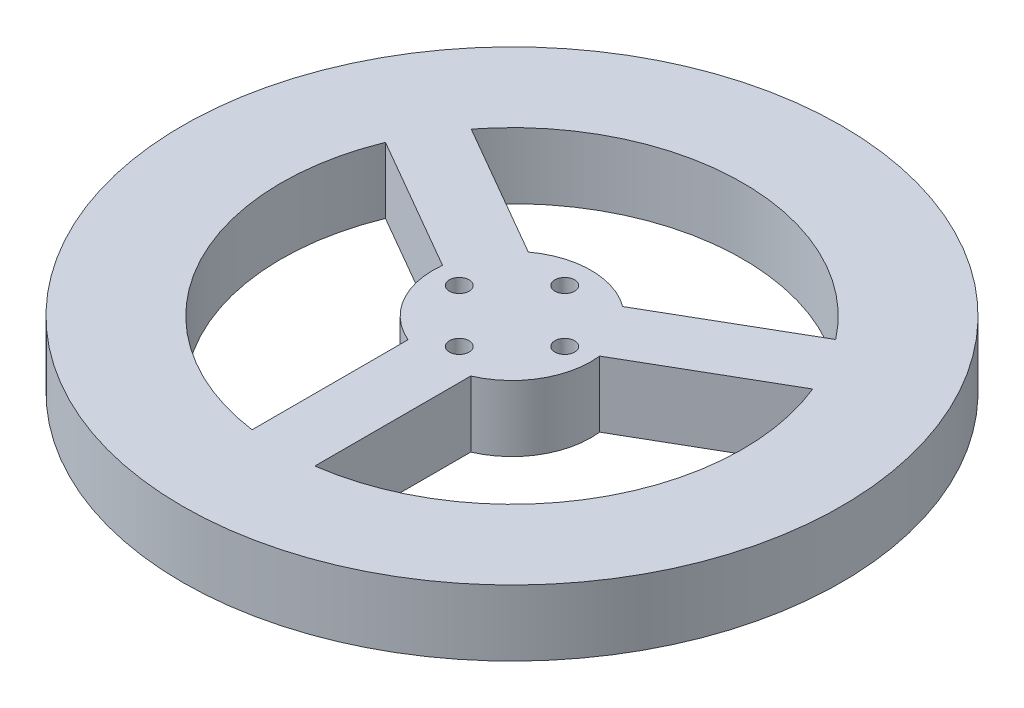
ISO-10303-21;
HEADER;
FILE_DESCRIPTION(('STEP AP214'),'2;1');
FILE_NAME('part.step','',(''),(''),'','','');
FILE_SCHEMA(('AUTOMOTIVE_DESIGN { 1 0 10303 214 1 1 1 1 }'));
ENDSEC;
DATA;
#1=APPLICATION_CONTEXT('core data for automotive mechanical design processes');
#2=APPLICATION_PROTOCOL_DEFINITION('international standard','automotive_design',2000,#1);
#3=PRODUCT_CONTEXT('',#1,'mechanical');
#4=PRODUCT('Part','Part','',(#3));
#5=PRODUCT_RELATED_PRODUCT_CATEGORY('part','',(#4));
#6=PRODUCT_DEFINITION_FORMATION('','',#4);
#7=PRODUCT_DEFINITION_CONTEXT('part definition',#1,'design');
#8=PRODUCT_DEFINITION('design','',#6,#7);
#9=PRODUCT_DEFINITION_SHAPE('','',#8);
#10=(LENGTH_UNIT() NAMED_UNIT(*) SI_UNIT(.MILLI.,.METRE.));
#11=(NAMED_UNIT(*) PLANE_ANGLE_UNIT() SI_UNIT($,.RADIAN.));
#12=(NAMED_UNIT(*) SI_UNIT($,.STERADIAN.) SOLID_ANGLE_UNIT());
#13=UNCERTAINTY_MEASURE_WITH_UNIT(LENGTH_MEASURE(1.E-05),#10,'distance_accuracy_value','');
#14=(GEOMETRIC_REPRESENTATION_CONTEXT(3) GLOBAL_UNCERTAINTY_ASSIGNED_CONTEXT((#13)) GLOBAL_UNIT_ASSIGNED_CONTEXT((#10,
#11,#12)) REPRESENTATION_CONTEXT('',''));
#15=CARTESIAN_POINT('',(0.,0.,0.));
#16=DIRECTION('',(0.,0.,1.));
#17=DIRECTION('',(1.,0.,0.));
#18=AXIS2_PLACEMENT_3D('',#15,#16,#17);
#19=CARTESIAN_POINT('',(0.,10.,0.));
#20=DIRECTION('',(0.,-1.,0.));
#21=DIRECTION('',(0.,0.,-1.));
#22=AXIS2_PLACEMENT_3D('',#19,#20,#21);
#23=CYLINDRICAL_SURFACE('',#22,12.);
#24=CARTESIAN_POINT('',(0.,0.,0.));
#25=DIRECTION('',(0.,1.,0.));
#26=DIRECTION('',(0.,0.,1.));
#27=AXIS2_PLACEMENT_3D('',#24,#25,#26);
#28=CIRCLE('',#27,12.);
#29=CARTESIAN_POINT('',(4.76313972081454,0.,11.0141953859553));
#30=VERTEX_POINT('',#29);
#31=CARTESIAN_POINT('',(11.9201428668899,0.,-1.38209769297769));
#32=VERTEX_POINT('',#31);
#33=EDGE_CURVE('E228',#30,#32,#28,.T.);
#34=ORIENTED_EDGE('',*,*,#33,.T.);
#35=DIRECTION('',(0.,-1.,0.));
#36=VECTOR('',#35,1.);
#37=CARTESIAN_POINT('',(11.9201428668899,10.,-1.38209769297769));
#38=LINE('',#37,#36);
#39=CARTESIAN_POINT('',(11.9201428668899,10.,-1.38209769297769));
#40=VERTEX_POINT('',#39);
#41=EDGE_CURVE('E11',#40,#32,#38,.T.);
#42=ORIENTED_EDGE('',*,*,#41,.F.);
#43=CARTESIAN_POINT('',(0.,10.,0.));
#44=DIRECTION('',(0.,1.,0.));
#45=DIRECTION('',(0.,0.,1.));
#46=AXIS2_PLACEMENT_3D('',#43,#44,#45);
#47=CIRCLE('',#46,12.);
#48=CARTESIAN_POINT('',(4.76313972081454,10.,11.0141953859553));
#49=VERTEX_POINT('',#48);
#50=EDGE_CURVE('E143',#49,#40,#47,.T.);
#51=ORIENTED_EDGE('',*,*,#50,.F.);
#52=DIRECTION('',(0.,-1.,0.));
#53=VECTOR('',#52,1.);
#54=CARTESIAN_POINT('',(4.76313972081454,10.,11.0141953859553));
#55=LINE('',#54,#53);
#56=EDGE_CURVE('E57',#49,#30,#55,.T.);
#57=ORIENTED_EDGE('',*,*,#56,.T.);
#58=EDGE_LOOP('',(#34,#42,#51,#57));
#59=FACE_BOUND('',#58,.T.);
#60=ADVANCED_FACE('F38',(#59),#23,.T.);
#61=CARTESIAN_POINT('',(2.38156986040723,10.,4.12500000000001));
#62=DIRECTION('',(-0.500000000000003,0.,-0.866025403784437));
#63=DIRECTION('',(-0.866025403784437,0.,0.500000000000003));
#64=AXIS2_PLACEMENT_3D('',#61,#62,#63);
#65=PLANE('',#64);
#66=DIRECTION('',(0.866025403784437,0.,-0.500000000000003));
#67=VECTOR('',#66,1.);
#68=CARTESIAN_POINT('',(2.38156986040723,0.,4.12500000000001));
#69=LINE('',#68,#67);
#70=CARTESIAN_POINT('',(32.4104621976216,0.,-13.2121890743572));
#71=VERTEX_POINT('',#70);
#72=EDGE_CURVE('E149',#32,#71,#69,.T.);
#73=ORIENTED_EDGE('',*,*,#72,.T.);
#74=DIRECTION('',(0.,-1.,0.));
#75=VECTOR('',#74,1.);
#76=CARTESIAN_POINT('',(32.4104621976216,10.,-13.2121890743572));
#77=LINE('',#76,#75);
#78=CARTESIAN_POINT('',(32.4104621976216,10.,-13.2121890743572));
#79=VERTEX_POINT('',#78);
#80=EDGE_CURVE('E48',#79,#71,#77,.T.);
#81=ORIENTED_EDGE('',*,*,#80,.F.);
#82=DIRECTION('',(0.866025403784437,0.,-0.500000000000003));
#83=VECTOR('',#82,1.);
#84=CARTESIAN_POINT('',(2.38156986040723,10.,4.12500000000001));
#85=LINE('',#84,#83);
#86=EDGE_CURVE('E136',#40,#79,#85,.T.);
#87=ORIENTED_EDGE('',*,*,#86,.F.);
#88=ORIENTED_EDGE('',*,*,#41,.T.);
#89=EDGE_LOOP('',(#73,#81,#87,#88));
#90=FACE_BOUND('',#89,.T.);
#91=ADVANCED_FACE('F148',(#90),#65,.F.);
#92=CARTESIAN_POINT('',(0.,10.,0.));
#93=DIRECTION('',(0.,-1.,0.));
#94=DIRECTION('',(0.,0.,-1.));
#95=AXIS2_PLACEMENT_3D('',#92,#93,#94);
#96=CYLINDRICAL_SURFACE('',#95,35.);
#97=CARTESIAN_POINT('',(0.,0.,0.));
#98=DIRECTION('',(0.,1.,0.));
#99=DIRECTION('',(0.,0.,1.));
#100=AXIS2_PLACEMENT_3D('',#97,#98,#99);
#101=CIRCLE('',#100,35.);
#102=CARTESIAN_POINT('',(4.76313972081497,0.,34.6743781487136));
#103=VERTEX_POINT('',#102);
#104=EDGE_CURVE('E215',#103,#71,#101,.T.);
#105=ORIENTED_EDGE('',*,*,#104,.F.);
#106=DIRECTION('',(0.,-1.,0.));
#107=VECTOR('',#106,1.);
#108=CARTESIAN_POINT('',(4.76313972081497,10.,34.6743781487136));
#109=LINE('',#108,#107);
#110=CARTESIAN_POINT('',(4.76313972081497,10.,34.6743781487136));
#111=VERTEX_POINT('',#110);
#112=EDGE_CURVE('E95',#111,#103,#109,.T.);
#113=ORIENTED_EDGE('',*,*,#112,.F.);
#114=CARTESIAN_POINT('',(0.,10.,0.));
#115=DIRECTION('',(0.,1.,0.));
#116=DIRECTION('',(0.,0.,1.));
#117=AXIS2_PLACEMENT_3D('',#114,#115,#116);
#118=CIRCLE('',#117,35.);
#119=EDGE_CURVE('E142',#111,#79,#118,.T.);
#120=ORIENTED_EDGE('',*,*,#119,.T.);
#121=ORIENTED_EDGE('',*,*,#80,.T.);
#122=EDGE_LOOP('',(#105,#113,#120,#121));
#123=FACE_BOUND('',#122,.T.);
#124=ADVANCED_FACE('F153',(#123),#96,.F.);
#125=CARTESIAN_POINT('',(-2.38156986040719,10.,4.12499999999998));
#126=DIRECTION('',(-0.5,0.,0.866025403784438));
#127=DIRECTION('',(0.866025403784438,0.,0.5));
#128=AXIS2_PLACEMENT_3D('',#125,#126,#127);
#129=PLANE('',#128);
#130=DIRECTION('',(-0.866025403784439,0.,-0.5));
#131=VECTOR('',#130,1.);
#132=CARTESIAN_POINT('',(-2.38156986040719,0.,4.12499999999998));
#133=LINE('',#132,#131);
#134=CARTESIAN_POINT('',(-11.9201428668899,0.,-1.3820976929777));
#135=VERTEX_POINT('',#134);
#136=CARTESIAN_POINT('',(-32.4104621976211,0.,-13.2121890743567));
#137=VERTEX_POINT('',#136);
#138=EDGE_CURVE('E219',#135,#137,#133,.T.);
#139=ORIENTED_EDGE('',*,*,#138,.F.);
#140=DIRECTION('',(0.,-1.,0.));
#141=VECTOR('',#140,1.);
#142=CARTESIAN_POINT('',(-11.9201428668899,10.,-1.3820976929777));
#143=LINE('',#142,#141);
#144=CARTESIAN_POINT('',(-11.9201428668899,10.,-1.3820976929777));
#145=VERTEX_POINT('',#144);
#146=EDGE_CURVE('E237',#145,#135,#143,.T.);
#147=ORIENTED_EDGE('',*,*,#146,.F.);
#148=DIRECTION('',(-0.866025403784439,0.,-0.5));
#149=VECTOR('',#148,1.);
#150=CARTESIAN_POINT('',(-2.38156986040719,10.,4.12499999999998));
#151=LINE('',#150,#149);
#152=CARTESIAN_POINT('',(-32.4104621976211,10.,-13.2121890743567));
#153=VERTEX_POINT('',#152);
#154=EDGE_CURVE('E169',#145,#153,#151,.T.);
#155=ORIENTED_EDGE('',*,*,#154,.T.);
#156=DIRECTION('',(0.,-1.,0.));
#157=VECTOR('',#156,1.);
#158=CARTESIAN_POINT('',(-32.4104621976211,10.,-13.2121890743567));
#159=LINE('',#158,#157);
#160=EDGE_CURVE('E239',#153,#137,#159,.T.);
#161=ORIENTED_EDGE('',*,*,#160,.T.);
#162=EDGE_LOOP('',(#139,#147,#155,#161));
#163=FACE_BOUND('',#162,.T.);
#164=ADVANCED_FACE('F276',(#163),#129,.T.);
#165=CARTESIAN_POINT('',(0.,10.,0.));
#166=DIRECTION('',(0.,-1.,0.));
#167=DIRECTION('',(0.,0.,-1.));
#168=AXIS2_PLACEMENT_3D('',#165,#166,#167);
#169=CYLINDRICAL_SURFACE('',#168,12.);
#170=CARTESIAN_POINT('',(0.,0.,0.));
#171=DIRECTION('',(0.,1.,0.));
#172=DIRECTION('',(0.,0.,1.));
#173=AXIS2_PLACEMENT_3D('',#170,#171,#172);
#174=CIRCLE('',#173,12.);
#175=CARTESIAN_POINT('',(-4.76313972081425,0.,11.0141953859554));
#176=VERTEX_POINT('',#175);
#177=EDGE_CURVE('E222',#135,#176,#174,.T.);
#178=ORIENTED_EDGE('',*,*,#177,.T.);
#179=DIRECTION('',(0.,-1.,0.));
#180=VECTOR('',#179,1.);
#181=CARTESIAN_POINT('',(-4.76313972081425,10.,11.0141953859554));
#182=LINE('',#181,#180);
#183=CARTESIAN_POINT('',(-4.76313972081425,10.,11.0141953859554));
#184=VERTEX_POINT('',#183);
#185=EDGE_CURVE('E243',#184,#176,#182,.T.);
#186=ORIENTED_EDGE('',*,*,#185,.F.);
#187=CARTESIAN_POINT('',(0.,10.,0.));
#188=DIRECTION('',(0.,1.,0.));
#189=DIRECTION('',(0.,0.,1.));
#190=AXIS2_PLACEMENT_3D('',#187,#188,#189);
#191=CIRCLE('',#190,12.);
#192=EDGE_CURVE('E536',#145,#184,#191,.T.);
#193=ORIENTED_EDGE('',*,*,#192,.F.);
#194=ORIENTED_EDGE('',*,*,#146,.T.);
#195=EDGE_LOOP('',(#178,#186,#193,#194));
#196=FACE_BOUND('',#195,.T.);
#197=ADVANCED_FACE('F286',(#196),#169,.T.);
#198=CARTESIAN_POINT('',(-4.7631397208145,10.,1.06893471664035E-13));
#199=DIRECTION('',(1.,0.,0.));
#200=DIRECTION('',(0.,0.,-1.));
#201=AXIS2_PLACEMENT_3D('',#198,#199,#200);
#202=PLANE('',#201);
#203=DIRECTION('',(0.,0.,1.));
#204=VECTOR('',#203,1.);
#205=CARTESIAN_POINT('',(-4.7631397208145,0.,1.06893471664035E-13));
#206=LINE('',#205,#204);
#207=CARTESIAN_POINT('',(-4.7631397208137,0.,34.674378148714));
#208=VERTEX_POINT('',#207);
#209=EDGE_CURVE('E225',#176,#208,#206,.T.);
#210=ORIENTED_EDGE('',*,*,#209,.T.);
#211=DIRECTION('',(0.,-1.,0.));
#212=VECTOR('',#211,1.);
#213=CARTESIAN_POINT('',(-4.7631397208137,10.,34.674378148714));
#214=LINE('',#213,#212);
#215=CARTESIAN_POINT('',(-4.7631397208137,10.,34.674378148714));
#216=VERTEX_POINT('',#215);
#217=EDGE_CURVE('E241',#216,#208,#214,.T.);
#218=ORIENTED_EDGE('',*,*,#217,.F.);
#219=DIRECTION('',(0.,0.,1.));
#220=VECTOR('',#219,1.);
#221=CARTESIAN_POINT('',(-4.7631397208145,10.,1.06893471664035E-13));
#222=LINE('',#221,#220);
#223=EDGE_CURVE('E163',#184,#216,#222,.T.);
#224=ORIENTED_EDGE('',*,*,#223,.F.);
#225=ORIENTED_EDGE('',*,*,#185,.T.);
#226=EDGE_LOOP('',(#210,#218,#224,#225));
#227=FACE_BOUND('',#226,.T.);
#228=ADVANCED_FACE('F283',(#227),#202,.F.);
#229=CARTESIAN_POINT('',(0.,10.,0.));
#230=DIRECTION('',(0.,-1.,0.));
#231=DIRECTION('',(0.,0.,-1.));
#232=AXIS2_PLACEMENT_3D('',#229,#230,#231);
#233=CYLINDRICAL_SURFACE('',#232,12.);
#234=CARTESIAN_POINT('',(0.,0.,0.));
#235=DIRECTION('',(0.,1.,0.));
#236=DIRECTION('',(0.,0.,1.));
#237=AXIS2_PLACEMENT_3D('',#234,#235,#236);
#238=CIRCLE('',#237,12.);
#239=CARTESIAN_POINT('',(7.15700314607549,0.,-9.63209769297767));
#240=VERTEX_POINT('',#239);
#241=CARTESIAN_POINT('',(-7.1570031460755,0.,-9.63209769297766));
#242=VERTEX_POINT('',#241);
#243=EDGE_CURVE('E198',#240,#242,#238,.T.);
#244=ORIENTED_EDGE('',*,*,#243,.T.);
#245=DIRECTION('',(0.,-1.,0.));
#246=VECTOR('',#245,1.);
#247=CARTESIAN_POINT('',(-7.1570031460755,10.,-9.63209769297766));
#248=LINE('',#247,#246);
#249=CARTESIAN_POINT('',(-7.1570031460755,10.,-9.63209769297766));
#250=VERTEX_POINT('',#249);
#251=EDGE_CURVE('E42',#250,#242,#248,.T.);
#252=ORIENTED_EDGE('',*,*,#251,.F.);
#253=CARTESIAN_POINT('',(0.,10.,0.));
#254=DIRECTION('',(0.,1.,0.));
#255=DIRECTION('',(0.,0.,1.));
#256=AXIS2_PLACEMENT_3D('',#253,#254,#255);
#257=CIRCLE('',#256,12.);
#258=CARTESIAN_POINT('',(7.15700314607549,10.,-9.63209769297767));
#259=VERTEX_POINT('',#258);
#260=EDGE_CURVE('E170',#259,#250,#257,.T.);
#261=ORIENTED_EDGE('',*,*,#260,.F.);
#262=DIRECTION('',(0.,-1.,0.));
#263=VECTOR('',#262,1.);
#264=CARTESIAN_POINT('',(7.15700314607549,10.,-9.63209769297767));
#265=LINE('',#264,#263);
#266=EDGE_CURVE('E247',#259,#240,#265,.T.);
#267=ORIENTED_EDGE('',*,*,#266,.T.);
#268=EDGE_LOOP('',(#244,#252,#261,#267));
#269=FACE_BOUND('',#268,.T.);
#270=ADVANCED_FACE('F40',(#269),#233,.T.);
#271=CARTESIAN_POINT('',(2.3815698604072,10.,-4.12500000000001));
#272=DIRECTION('',(-0.499999999999997,0.,0.86602540378444));
#273=DIRECTION('',(0.86602540378444,0.,0.499999999999997));
#274=AXIS2_PLACEMENT_3D('',#271,#272,#273);
#275=PLANE('',#274);
#276=DIRECTION('',(-0.86602540378444,0.,-0.499999999999997));
#277=VECTOR('',#276,1.);
#278=CARTESIAN_POINT('',(2.3815698604072,0.,-4.12500000000001));
#279=LINE('',#278,#277);
#280=CARTESIAN_POINT('',(-27.647322476807,0.,-21.4621890743568));
#281=VERTEX_POINT('',#280);
#282=EDGE_CURVE('E202',#242,#281,#279,.T.);
#283=ORIENTED_EDGE('',*,*,#282,.T.);
#284=DIRECTION('',(0.,-1.,0.));
#285=VECTOR('',#284,1.);
#286=CARTESIAN_POINT('',(-27.647322476807,10.,-21.4621890743568));
#287=LINE('',#286,#285);
#288=CARTESIAN_POINT('',(-27.647322476807,10.,-21.4621890743568));
#289=VERTEX_POINT('',#288);
#290=EDGE_CURVE('E250',#289,#281,#287,.T.);
#291=ORIENTED_EDGE('',*,*,#290,.F.);
#292=DIRECTION('',(-0.86602540378444,0.,-0.499999999999997));
#293=VECTOR('',#292,1.);
#294=CARTESIAN_POINT('',(2.3815698604072,10.,-4.12500000000001));
#295=LINE('',#294,#293);
#296=EDGE_CURVE('E108',#250,#289,#295,.T.);
#297=ORIENTED_EDGE('',*,*,#296,.F.);
#298=ORIENTED_EDGE('',*,*,#251,.T.);
#299=EDGE_LOOP('',(#283,#291,#297,#298));
#300=FACE_BOUND('',#299,.T.);
#301=ADVANCED_FACE('F252',(#300),#275,.F.);
#302=CARTESIAN_POINT('',(27.647322476807,0.,-21.4621890743569));
#303=VERTEX_POINT('',#302);
#304=EDGE_CURVE('E208',#303,#281,#101,.T.);
#305=ORIENTED_EDGE('',*,*,#304,.F.);
#306=DIRECTION('',(0.,-1.,0.));
#307=VECTOR('',#306,1.);
#308=CARTESIAN_POINT('',(27.647322476807,10.,-21.4621890743569));
#309=LINE('',#308,#307);
#310=CARTESIAN_POINT('',(27.647322476807,10.,-21.4621890743569));
#311=VERTEX_POINT('',#310);
#312=EDGE_CURVE('E249',#311,#303,#309,.T.);
#313=ORIENTED_EDGE('',*,*,#312,.F.);
#314=EDGE_CURVE('E157',#311,#289,#118,.T.);
#315=ORIENTED_EDGE('',*,*,#314,.T.);
#316=ORIENTED_EDGE('',*,*,#290,.T.);
#317=EDGE_LOOP('',(#305,#313,#315,#316));
#318=FACE_BOUND('',#317,.T.);
#319=ADVANCED_FACE('F262',(#318),#96,.F.);
#320=CARTESIAN_POINT('',(4.76313972081435,10.,0.));
#321=DIRECTION('',(1.,0.,0.));
#322=DIRECTION('',(0.,0.,-1.));
#323=AXIS2_PLACEMENT_3D('',#320,#321,#322);
#324=PLANE('',#323);
#325=DIRECTION('',(0.,0.,1.));
#326=VECTOR('',#325,1.);
#327=CARTESIAN_POINT('',(4.76313972081435,0.,0.));
#328=LINE('',#327,#326);
#329=EDGE_CURVE('E231',#30,#103,#328,.T.);
#330=ORIENTED_EDGE('',*,*,#329,.F.);
#331=ORIENTED_EDGE('',*,*,#56,.F.);
#332=DIRECTION('',(0.,0.,1.));
#333=VECTOR('',#332,1.);
#334=CARTESIAN_POINT('',(4.76313972081435,10.,0.));
#335=LINE('',#334,#333);
#336=EDGE_CURVE('E154',#49,#111,#335,.T.);
#337=ORIENTED_EDGE('',*,*,#336,.T.);
#338=ORIENTED_EDGE('',*,*,#112,.T.);
#339=EDGE_LOOP('',(#330,#331,#337,#338));
#340=FACE_BOUND('',#339,.T.);
#341=ADVANCED_FACE('F264',(#340),#324,.T.);
#342=EDGE_CURVE('E216',#137,#208,#101,.T.);
#343=ORIENTED_EDGE('',*,*,#342,.F.);
#344=ORIENTED_EDGE('',*,*,#160,.F.);
#345=EDGE_CURVE('E156',#153,#216,#118,.T.);
#346=ORIENTED_EDGE('',*,*,#345,.T.);
#347=ORIENTED_EDGE('',*,*,#217,.T.);
#348=EDGE_LOOP('',(#343,#344,#346,#347));
#349=FACE_BOUND('',#348,.T.);
#350=ADVANCED_FACE('F266',(#349),#96,.F.);
#351=CARTESIAN_POINT('',(-2.3815698604072,10.,-4.12500000000001));
#352=DIRECTION('',(-0.499999999999999,0.,-0.86602540378444));
#353=DIRECTION('',(-0.86602540378444,0.,0.499999999999999));
#354=AXIS2_PLACEMENT_3D('',#351,#352,#353);
#355=PLANE('',#354);
#356=DIRECTION('',(0.86602540378444,0.,-0.499999999999999));
#357=VECTOR('',#356,1.);
#358=CARTESIAN_POINT('',(-2.3815698604072,0.,-4.12500000000001));
#359=LINE('',#358,#357);
#360=EDGE_CURVE('E214',#240,#303,#359,.T.);
#361=ORIENTED_EDGE('',*,*,#360,.F.);
#362=ORIENTED_EDGE('',*,*,#266,.F.);
#363=DIRECTION('',(0.86602540378444,0.,-0.499999999999999));
#364=VECTOR('',#363,1.);
#365=CARTESIAN_POINT('',(-2.3815698604072,10.,-4.12500000000001));
#366=LINE('',#365,#364);
#367=EDGE_CURVE('E165',#259,#311,#366,.T.);
#368=ORIENTED_EDGE('',*,*,#367,.T.);
#369=ORIENTED_EDGE('',*,*,#312,.T.);
#370=EDGE_LOOP('',(#361,#362,#368,#369));
#371=FACE_BOUND('',#370,.T.);
#372=ADVANCED_FACE('F258',(#371),#355,.T.);
#373=CARTESIAN_POINT('',(0.,10.,0.));
#374=DIRECTION('',(0.,-1.,0.));
#375=DIRECTION('',(0.,0.,-1.));
#376=AXIS2_PLACEMENT_3D('',#373,#374,#375);
#377=CYLINDRICAL_SURFACE('',#376,50.);
#378=CARTESIAN_POINT('',(0.,10.,0.));
#379=DIRECTION('',(0.,1.,0.));
#380=DIRECTION('',(0.,0.,1.));
#381=AXIS2_PLACEMENT_3D('',#378,#379,#380);
#382=CIRCLE('',#381,50.);
#383=CARTESIAN_POINT('',(0.,10.,50.));
#384=VERTEX_POINT('',#383);
#385=EDGE_CURVE('E158',#384,#384,#382,.T.);
#386=ORIENTED_EDGE('',*,*,#385,.F.);
#387=EDGE_LOOP('',(#386));
#388=FACE_BOUND('',#387,.T.);
#389=CARTESIAN_POINT('',(0.,0.,0.));
#390=DIRECTION('',(0.,1.,0.));
#391=DIRECTION('',(0.,0.,1.));
#392=AXIS2_PLACEMENT_3D('',#389,#390,#391);
#393=CIRCLE('',#392,50.);
#394=CARTESIAN_POINT('',(0.,0.,50.));
#395=VERTEX_POINT('',#394);
#396=EDGE_CURVE('E172',#395,#395,#393,.T.);
#397=ORIENTED_EDGE('',*,*,#396,.T.);
#398=EDGE_LOOP('',(#397));
#399=FACE_BOUND('',#398,.T.);
#400=ADVANCED_FACE('F295',(#388,#399),#377,.T.);
#401=CARTESIAN_POINT('',(0.,10.,0.));
#402=DIRECTION('',(0.,1.,0.));
#403=DIRECTION('',(0.,0.,1.));
#404=AXIS2_PLACEMENT_3D('',#401,#402,#403);
#405=PLANE('',#404);
#406=CARTESIAN_POINT('',(0.,10.,-8.));
#407=DIRECTION('',(0.,1.,0.));
#408=DIRECTION('',(0.,0.,1.));
#409=AXIS2_PLACEMENT_3D('',#406,#407,#408);
#410=CIRCLE('',#409,1.5);
#411=CARTESIAN_POINT('',(0.,10.,-6.5));
#412=VERTEX_POINT('',#411);
#413=EDGE_CURVE('E193',#412,#412,#410,.T.);
#414=ORIENTED_EDGE('',*,*,#413,.F.);
#415=EDGE_LOOP('',(#414));
#416=FACE_BOUND('',#415,.T.);
#417=CARTESIAN_POINT('',(8.00000000000023,10.,-2.26393958003914E-13));
#418=DIRECTION('',(0.,1.,0.));
#419=DIRECTION('',(0.,0.,1.));
#420=AXIS2_PLACEMENT_3D('',#417,#418,#419);
#421=CIRCLE('',#420,1.50000000000018);
#422=CARTESIAN_POINT('',(8.00000000000023,10.,1.49999999999995));
#423=VERTEX_POINT('',#422);
#424=EDGE_CURVE('E187',#423,#423,#421,.T.);
#425=ORIENTED_EDGE('',*,*,#424,.F.);
#426=EDGE_LOOP('',(#425));
#427=FACE_BOUND('',#426,.T.);
#428=CARTESIAN_POINT('',(4.52787916007828E-13,10.,8.));
#429=DIRECTION('',(0.,1.,0.));
#430=DIRECTION('',(0.,0.,1.));
#431=AXIS2_PLACEMENT_3D('',#428,#429,#430);
#432=CIRCLE('',#431,1.50000000000049);
#433=CARTESIAN_POINT('',(4.52787916007828E-13,10.,9.50000000000049));
#434=VERTEX_POINT('',#433);
#435=EDGE_CURVE('E181',#434,#434,#432,.T.);
#436=ORIENTED_EDGE('',*,*,#435,.F.);
#437=EDGE_LOOP('',(#436));
#438=FACE_BOUND('',#437,.T.);
#439=CARTESIAN_POINT('',(-7.99999999999977,10.,2.27373675443232E-13));
#440=DIRECTION('',(0.,1.,0.));
#441=DIRECTION('',(0.,0.,1.));
#442=AXIS2_PLACEMENT_3D('',#439,#440,#441);
#443=CIRCLE('',#442,1.50000000000036);
#444=CARTESIAN_POINT('',(-7.99999999999977,10.,1.50000000000059));
#445=VERTEX_POINT('',#444);
#446=EDGE_CURVE('E175',#445,#445,#443,.T.);
#447=ORIENTED_EDGE('',*,*,#446,.F.);
#448=EDGE_LOOP('',(#447));
#449=FACE_BOUND('',#448,.T.);
#450=ORIENTED_EDGE('',*,*,#260,.T.);
#451=ORIENTED_EDGE('',*,*,#296,.T.);
#452=ORIENTED_EDGE('',*,*,#314,.F.);
#453=ORIENTED_EDGE('',*,*,#367,.F.);
#454=EDGE_LOOP('',(#450,#451,#452,#453));
#455=FACE_BOUND('',#454,.T.);
#456=ORIENTED_EDGE('',*,*,#154,.F.);
#457=ORIENTED_EDGE('',*,*,#192,.T.);
#458=ORIENTED_EDGE('',*,*,#223,.T.);
#459=ORIENTED_EDGE('',*,*,#345,.F.);
#460=EDGE_LOOP('',(#456,#457,#458,#459));
#461=FACE_BOUND('',#460,.T.);
#462=ORIENTED_EDGE('',*,*,#50,.T.);
#463=ORIENTED_EDGE('',*,*,#86,.T.);
#464=ORIENTED_EDGE('',*,*,#119,.F.);
#465=ORIENTED_EDGE('',*,*,#336,.F.);
#466=EDGE_LOOP('',(#462,#463,#464,#465));
#467=FACE_BOUND('',#466,.T.);
#468=ORIENTED_EDGE('',*,*,#385,.T.);
#469=EDGE_LOOP('',(#468));
#470=FACE_BOUND('',#469,.T.);
#471=ADVANCED_FACE('F138',(#416,#427,#438,#449,#455,#461,#467,#470),#405,.T.);
#472=CARTESIAN_POINT('',(0.,0.,0.));
#473=DIRECTION('',(0.,1.,0.));
#474=DIRECTION('',(0.,0.,1.));
#475=AXIS2_PLACEMENT_3D('',#472,#473,#474);
#476=PLANE('',#475);
#477=ORIENTED_EDGE('',*,*,#243,.F.);
#478=ORIENTED_EDGE('',*,*,#360,.T.);
#479=ORIENTED_EDGE('',*,*,#304,.T.);
#480=ORIENTED_EDGE('',*,*,#282,.F.);
#481=EDGE_LOOP('',(#477,#478,#479,#480));
#482=FACE_BOUND('',#481,.T.);
#483=ORIENTED_EDGE('',*,*,#138,.T.);
#484=ORIENTED_EDGE('',*,*,#342,.T.);
#485=ORIENTED_EDGE('',*,*,#209,.F.);
#486=ORIENTED_EDGE('',*,*,#177,.F.);
#487=EDGE_LOOP('',(#483,#484,#485,#486));
#488=FACE_BOUND('',#487,.T.);
#489=ORIENTED_EDGE('',*,*,#33,.F.);
#490=ORIENTED_EDGE('',*,*,#329,.T.);
#491=ORIENTED_EDGE('',*,*,#104,.T.);
#492=ORIENTED_EDGE('',*,*,#72,.F.);
#493=EDGE_LOOP('',(#489,#490,#491,#492));
#494=FACE_BOUND('',#493,.T.);
#495=ORIENTED_EDGE('',*,*,#396,.F.);
#496=EDGE_LOOP('',(#495));
#497=FACE_BOUND('',#496,.T.);
#498=ADVANCED_FACE('F260',(#482,#488,#494,#497),#476,.F.);
#499=CARTESIAN_POINT('',(-7.99999999999977,5.,2.27373675443232E-13));
#500=DIRECTION('',(0.,1.,0.));
#501=DIRECTION('',(0.,0.,1.));
#502=AXIS2_PLACEMENT_3D('',#499,#500,#501);
#503=CYLINDRICAL_SURFACE('',#502,1.50000000000036);
#504=CARTESIAN_POINT('',(-7.99999999999977,5.,2.27373675443232E-13));
#505=DIRECTION('',(0.,1.,0.));
#506=DIRECTION('',(0.,0.,1.));
#507=AXIS2_PLACEMENT_3D('',#504,#505,#506);
#508=CIRCLE('',#507,1.50000000000036);
#509=CARTESIAN_POINT('',(-7.99999999999977,5.,1.50000000000059));
#510=VERTEX_POINT('',#509);
#511=EDGE_CURVE('E178',#510,#510,#508,.T.);
#512=ORIENTED_EDGE('',*,*,#511,.F.);
#513=EDGE_LOOP('',(#512));
#514=FACE_BOUND('',#513,.T.);
#515=ORIENTED_EDGE('',*,*,#446,.T.);
#516=EDGE_LOOP('',(#515));
#517=FACE_BOUND('',#516,.T.);
#518=ADVANCED_FACE('F310',(#514,#517),#503,.F.);
#519=CARTESIAN_POINT('',(-7.99999999999977,5.,2.27373675443232E-13));
#520=DIRECTION('',(0.,1.,0.));
#521=DIRECTION('',(0.,0.,1.));
#522=AXIS2_PLACEMENT_3D('',#519,#520,#521);
#523=PLANE('',#522);
#524=ORIENTED_EDGE('',*,*,#511,.T.);
#525=EDGE_LOOP('',(#524));
#526=FACE_BOUND('',#525,.T.);
#527=ADVANCED_FACE('F314',(#526),#523,.T.);
#528=CARTESIAN_POINT('',(4.52787916007828E-13,5.,8.));
#529=DIRECTION('',(0.,1.,0.));
#530=DIRECTION('',(0.,0.,1.));
#531=AXIS2_PLACEMENT_3D('',#528,#529,#530);
#532=CYLINDRICAL_SURFACE('',#531,1.50000000000049);
#533=CARTESIAN_POINT('',(4.52787916007828E-13,5.,8.));
#534=DIRECTION('',(0.,1.,0.));
#535=DIRECTION('',(0.,0.,1.));
#536=AXIS2_PLACEMENT_3D('',#533,#534,#535);
#537=CIRCLE('',#536,1.50000000000049);
#538=CARTESIAN_POINT('',(4.52787916007828E-13,5.,9.50000000000049));
#539=VERTEX_POINT('',#538);
#540=EDGE_CURVE('E184',#539,#539,#537,.T.);
#541=ORIENTED_EDGE('',*,*,#540,.F.);
#542=EDGE_LOOP('',(#541));
#543=FACE_BOUND('',#542,.T.);
#544=ORIENTED_EDGE('',*,*,#435,.T.);
#545=EDGE_LOOP('',(#544));
#546=FACE_BOUND('',#545,.T.);
#547=ADVANCED_FACE('F318',(#543,#546),#532,.F.);
#548=CARTESIAN_POINT('',(4.52787916007828E-13,5.,8.));
#549=DIRECTION('',(0.,1.,0.));
#550=DIRECTION('',(0.,0.,1.));
#551=AXIS2_PLACEMENT_3D('',#548,#549,#550);
#552=PLANE('',#551);
#553=ORIENTED_EDGE('',*,*,#540,.T.);
#554=EDGE_LOOP('',(#553));
#555=FACE_BOUND('',#554,.T.);
#556=ADVANCED_FACE('F322',(#555),#552,.T.);
#557=CARTESIAN_POINT('',(8.00000000000023,5.,-2.26393958003914E-13));
#558=DIRECTION('',(0.,1.,0.));
#559=DIRECTION('',(0.,0.,1.));
#560=AXIS2_PLACEMENT_3D('',#557,#558,#559);
#561=CYLINDRICAL_SURFACE('',#560,1.50000000000018);
#562=CARTESIAN_POINT('',(8.00000000000023,5.,-2.26393958003914E-13));
#563=DIRECTION('',(0.,1.,0.));
#564=DIRECTION('',(0.,0.,1.));
#565=AXIS2_PLACEMENT_3D('',#562,#563,#564);
#566=CIRCLE('',#565,1.50000000000018);
#567=CARTESIAN_POINT('',(8.00000000000023,5.,1.49999999999995));
#568=VERTEX_POINT('',#567);
#569=EDGE_CURVE('E190',#568,#568,#566,.T.);
#570=ORIENTED_EDGE('',*,*,#569,.F.);
#571=EDGE_LOOP('',(#570));
#572=FACE_BOUND('',#571,.T.);
#573=ORIENTED_EDGE('',*,*,#424,.T.);
#574=EDGE_LOOP('',(#573));
#575=FACE_BOUND('',#574,.T.);
#576=ADVANCED_FACE('F326',(#572,#575),#561,.F.);
#577=CARTESIAN_POINT('',(8.00000000000023,5.,-2.26393958003914E-13));
#578=DIRECTION('',(0.,1.,0.));
#579=DIRECTION('',(0.,0.,1.));
#580=AXIS2_PLACEMENT_3D('',#577,#578,#579);
#581=PLANE('',#580);
#582=ORIENTED_EDGE('',*,*,#569,.T.);
#583=EDGE_LOOP('',(#582));
#584=FACE_BOUND('',#583,.T.);
#585=ADVANCED_FACE('F330',(#584),#581,.T.);
#586=CARTESIAN_POINT('',(0.,5.,-8.));
#587=DIRECTION('',(0.,1.,0.));
#588=DIRECTION('',(0.,0.,1.));
#589=AXIS2_PLACEMENT_3D('',#586,#587,#588);
#590=CYLINDRICAL_SURFACE('',#589,1.5);
#591=CARTESIAN_POINT('',(0.,5.,-8.));
#592=DIRECTION('',(0.,1.,0.));
#593=DIRECTION('',(0.,0.,1.));
#594=AXIS2_PLACEMENT_3D('',#591,#592,#593);
#595=CIRCLE('',#594,1.5);
#596=CARTESIAN_POINT('',(0.,5.,-6.5));
#597=VERTEX_POINT('',#596);
#598=EDGE_CURVE('E196',#597,#597,#595,.T.);
#599=ORIENTED_EDGE('',*,*,#598,.F.);
#600=EDGE_LOOP('',(#599));
#601=FACE_BOUND('',#600,.T.);
#602=ORIENTED_EDGE('',*,*,#413,.T.);
#603=EDGE_LOOP('',(#602));
#604=FACE_BOUND('',#603,.T.);
#605=ADVANCED_FACE('F334',(#601,#604),#590,.F.);
#606=CARTESIAN_POINT('',(0.,5.,-8.));
#607=DIRECTION('',(0.,1.,0.));
#608=DIRECTION('',(0.,0.,1.));
#609=AXIS2_PLACEMENT_3D('',#606,#607,#608);
#610=PLANE('',#609);
#611=ORIENTED_EDGE('',*,*,#598,.T.);
#612=EDGE_LOOP('',(#611));
#613=FACE_BOUND('',#612,.T.);
#614=ADVANCED_FACE('F338',(#613),#610,.T.);
#615=CLOSED_SHELL('',(#60,#91,#124,#164,#197,#228,#270,#301,#319,#341,#350,#372,#400,#471,#498,
#518,#527,#547,#556,#576,#585,#605,#614));
#616=MANIFOLD_SOLID_BREP('B2',#615);
#617=ADVANCED_BREP_SHAPE_REPRESENTATION('',(#18,#616),#14);
#618=SHAPE_DEFINITION_REPRESENTATION(#9,#617);
ENDSEC;
END-ISO-10303-21;
